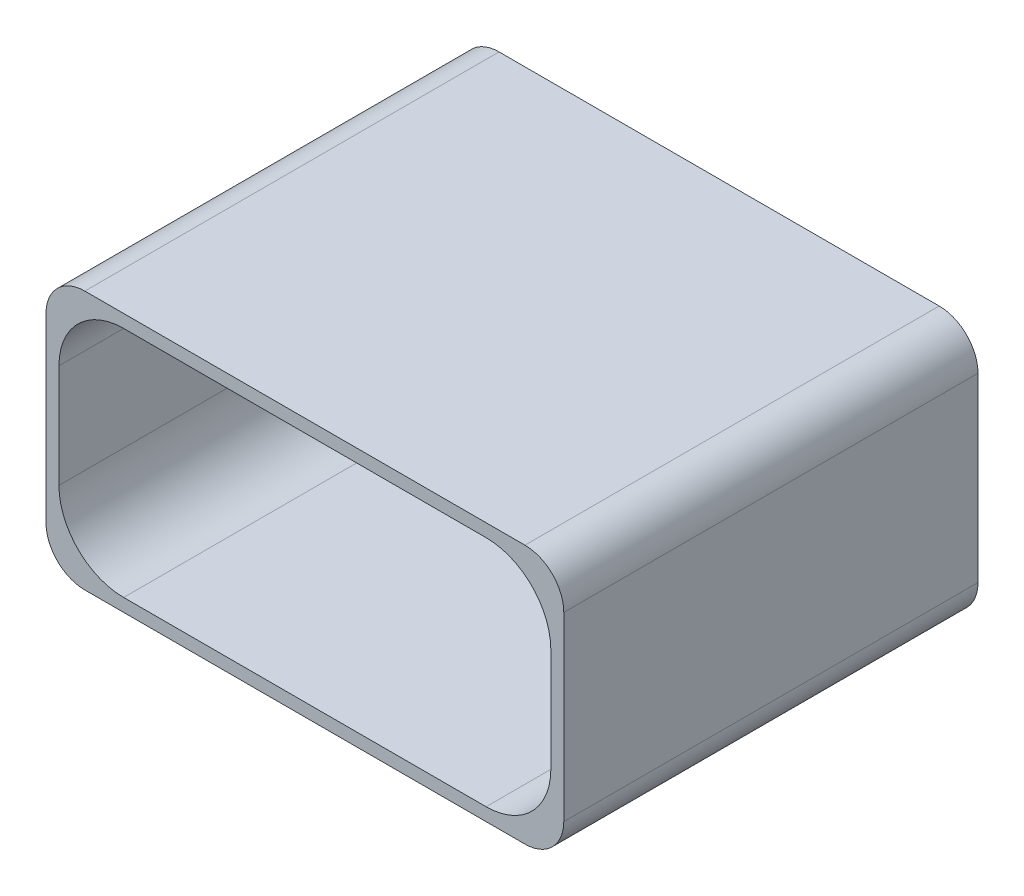
ISO-10303-21;
HEADER;
FILE_DESCRIPTION(('STEP AP214'),'2;1');
FILE_NAME('part.step','',(''),(''),'','','');
FILE_SCHEMA(('AUTOMOTIVE_DESIGN { 1 0 10303 214 1 1 1 1 }'));
ENDSEC;
DATA;
#1=APPLICATION_CONTEXT('core data for automotive mechanical design processes');
#2=APPLICATION_PROTOCOL_DEFINITION('international standard','automotive_design',2000,#1);
#3=PRODUCT_CONTEXT('',#1,'mechanical');
#4=PRODUCT('Part','Part','',(#3));
#5=PRODUCT_RELATED_PRODUCT_CATEGORY('part','',(#4));
#6=PRODUCT_DEFINITION_FORMATION('','',#4);
#7=PRODUCT_DEFINITION_CONTEXT('part definition',#1,'design');
#8=PRODUCT_DEFINITION('design','',#6,#7);
#9=PRODUCT_DEFINITION_SHAPE('','',#8);
#10=(LENGTH_UNIT() NAMED_UNIT(*) SI_UNIT(.MILLI.,.METRE.));
#11=(NAMED_UNIT(*) PLANE_ANGLE_UNIT() SI_UNIT($,.RADIAN.));
#12=(NAMED_UNIT(*) SI_UNIT($,.STERADIAN.) SOLID_ANGLE_UNIT());
#13=UNCERTAINTY_MEASURE_WITH_UNIT(LENGTH_MEASURE(1.E-05),#10,'distance_accuracy_value','');
#14=(GEOMETRIC_REPRESENTATION_CONTEXT(3) GLOBAL_UNCERTAINTY_ASSIGNED_CONTEXT((#13)) GLOBAL_UNIT_ASSIGNED_CONTEXT((#10,
#11,#12)) REPRESENTATION_CONTEXT('',''));
#15=CARTESIAN_POINT('',(0.,0.,0.));
#16=DIRECTION('',(0.,0.,1.));
#17=DIRECTION('',(1.,0.,0.));
#18=AXIS2_PLACEMENT_3D('',#15,#16,#17);
#19=CARTESIAN_POINT('',(0.,0.,10.));
#20=DIRECTION('',(0.,0.,1.));
#21=DIRECTION('',(1.,0.,0.));
#22=AXIS2_PLACEMENT_3D('',#19,#20,#21);
#23=PLANE('',#22);
#24=DIRECTION('',(-1.,0.,0.));
#25=VECTOR('',#24,1.);
#26=CARTESIAN_POINT('',(0.,39.5,10.));
#27=LINE('',#26,#25);
#28=CARTESIAN_POINT('',(144.,39.5,10.));
#29=VERTEX_POINT('',#28);
#30=CARTESIAN_POINT('',(134.,39.5,10.));
#31=VERTEX_POINT('',#30);
#32=EDGE_CURVE('E314',#29,#31,#27,.T.);
#33=ORIENTED_EDGE('',*,*,#32,.T.);
#34=DIRECTION('',(0.,-1.,0.));
#35=VECTOR('',#34,1.);
#36=CARTESIAN_POINT('',(134.,0.,10.));
#37=LINE('',#36,#35);
#38=CARTESIAN_POINT('',(134.,49.5,10.));
#39=VERTEX_POINT('',#38);
#40=EDGE_CURVE('E332',#39,#31,#37,.T.);
#41=ORIENTED_EDGE('',*,*,#40,.F.);
#42=DIRECTION('',(-1.,0.,0.));
#43=VECTOR('',#42,1.);
#44=CARTESIAN_POINT('',(0.,49.5,10.));
#45=LINE('',#44,#43);
#46=CARTESIAN_POINT('',(135.,49.5,10.));
#47=VERTEX_POINT('',#46);
#48=EDGE_CURVE('E380',#47,#39,#45,.T.);
#49=ORIENTED_EDGE('',*,*,#48,.F.);
#50=DIRECTION('',(0.,1.,0.));
#51=VECTOR('',#50,1.);
#52=CARTESIAN_POINT('',(135.,0.,10.));
#53=LINE('',#52,#51);
#54=CARTESIAN_POINT('',(135.,50.5,10.));
#55=VERTEX_POINT('',#54);
#56=EDGE_CURVE('E376',#47,#55,#53,.T.);
#57=ORIENTED_EDGE('',*,*,#56,.T.);
#58=DIRECTION('',(-1.,0.,0.));
#59=VECTOR('',#58,1.);
#60=CARTESIAN_POINT('',(0.,50.5,10.));
#61=LINE('',#60,#59);
#62=CARTESIAN_POINT('',(134.,50.5,10.));
#63=VERTEX_POINT('',#62);
#64=EDGE_CURVE('E372',#55,#63,#61,.T.);
#65=ORIENTED_EDGE('',*,*,#64,.T.);
#66=DIRECTION('',(0.,1.,0.));
#67=VECTOR('',#66,1.);
#68=CARTESIAN_POINT('',(134.,0.,10.));
#69=LINE('',#68,#67);
#70=CARTESIAN_POINT('',(134.,60.5,10.));
#71=VERTEX_POINT('',#70);
#72=EDGE_CURVE('E368',#63,#71,#69,.T.);
#73=ORIENTED_EDGE('',*,*,#72,.T.);
#74=DIRECTION('',(1.,0.,0.));
#75=VECTOR('',#74,1.);
#76=CARTESIAN_POINT('',(0.,60.5,10.));
#77=LINE('',#76,#75);
#78=CARTESIAN_POINT('',(144.,60.5,10.));
#79=VERTEX_POINT('',#78);
#80=EDGE_CURVE('E364',#71,#79,#77,.T.);
#81=ORIENTED_EDGE('',*,*,#80,.T.);
#82=DIRECTION('',(0.,-1.,0.));
#83=VECTOR('',#82,1.);
#84=CARTESIAN_POINT('',(144.,0.,10.));
#85=LINE('',#84,#83);
#86=EDGE_CURVE('E361',#79,#29,#85,.T.);
#87=ORIENTED_EDGE('',*,*,#86,.T.);
#88=EDGE_LOOP('',(#33,#41,#49,#57,#65,#73,#81,#87));
#89=FACE_BOUND('',#88,.T.);
#90=CARTESIAN_POINT('',(170.,70.,10.));
#91=DIRECTION('',(0.,0.,1.));
#92=DIRECTION('',(1.,0.,0.));
#93=AXIS2_PLACEMENT_3D('',#90,#91,#92);
#94=CIRCLE('',#93,25.);
#95=CARTESIAN_POINT('',(170.,95.,10.));
#96=VERTEX_POINT('',#95);
#97=CARTESIAN_POINT('',(195.,69.9999999999998,10.));
#98=VERTEX_POINT('',#97);
#99=EDGE_CURVE('E491',#96,#98,#94,.F.);
#100=ORIENTED_EDGE('',*,*,#99,.F.);
#101=DIRECTION('',(1.,0.,0.));
#102=VECTOR('',#101,1.);
#103=CARTESIAN_POINT('',(0.,95.,10.));
#104=LINE('',#103,#102);
#105=CARTESIAN_POINT('',(30.0000000000001,95.,10.));
#106=VERTEX_POINT('',#105);
#107=EDGE_CURVE('E485',#106,#96,#104,.T.);
#108=ORIENTED_EDGE('',*,*,#107,.F.);
#109=CARTESIAN_POINT('',(30.,70.,10.));
#110=DIRECTION('',(0.,0.,1.));
#111=DIRECTION('',(1.,0.,0.));
#112=AXIS2_PLACEMENT_3D('',#109,#110,#111);
#113=CIRCLE('',#112,25.);
#114=CARTESIAN_POINT('',(5.,69.9999999999999,10.));
#115=VERTEX_POINT('',#114);
#116=EDGE_CURVE('E522',#106,#115,#113,.T.);
#117=ORIENTED_EDGE('',*,*,#116,.T.);
#118=DIRECTION('',(0.,1.,0.));
#119=VECTOR('',#118,1.);
#120=CARTESIAN_POINT('',(5.,0.,10.));
#121=LINE('',#120,#119);
#122=CARTESIAN_POINT('',(5.,30.0000000000002,10.));
#123=VERTEX_POINT('',#122);
#124=EDGE_CURVE('E526',#123,#115,#121,.T.);
#125=ORIENTED_EDGE('',*,*,#124,.F.);
#126=CARTESIAN_POINT('',(30.,30.,10.));
#127=DIRECTION('',(0.,0.,1.));
#128=DIRECTION('',(1.,0.,0.));
#129=AXIS2_PLACEMENT_3D('',#126,#127,#128);
#130=CIRCLE('',#129,25.);
#131=CARTESIAN_POINT('',(30.0000000000001,4.99999999999998,10.));
#132=VERTEX_POINT('',#131);
#133=EDGE_CURVE('E530',#132,#123,#130,.F.);
#134=ORIENTED_EDGE('',*,*,#133,.F.);
#135=DIRECTION('',(-1.,0.,0.));
#136=VECTOR('',#135,1.);
#137=CARTESIAN_POINT('',(0.,4.99999999999998,10.));
#138=LINE('',#137,#136);
#139=CARTESIAN_POINT('',(170.,4.99999999999999,10.));
#140=VERTEX_POINT('',#139);
#141=EDGE_CURVE('E534',#140,#132,#138,.T.);
#142=ORIENTED_EDGE('',*,*,#141,.F.);
#143=CARTESIAN_POINT('',(170.,30.,10.));
#144=DIRECTION('',(0.,0.,1.));
#145=DIRECTION('',(1.,0.,0.));
#146=AXIS2_PLACEMENT_3D('',#143,#144,#145);
#147=CIRCLE('',#146,25.);
#148=CARTESIAN_POINT('',(195.,30.0000000000001,10.));
#149=VERTEX_POINT('',#148);
#150=EDGE_CURVE('E538',#149,#140,#147,.F.);
#151=ORIENTED_EDGE('',*,*,#150,.F.);
#152=DIRECTION('',(0.,-1.,0.));
#153=VECTOR('',#152,1.);
#154=CARTESIAN_POINT('',(195.,0.,10.));
#155=LINE('',#154,#153);
#156=EDGE_CURVE('E542',#98,#149,#155,.T.);
#157=ORIENTED_EDGE('',*,*,#156,.F.);
#158=EDGE_LOOP('',(#100,#108,#117,#125,#134,#142,#151,#157));
#159=FACE_BOUND('',#158,.T.);
#160=DIRECTION('',(0.,-1.,0.));
#161=VECTOR('',#160,1.);
#162=CARTESIAN_POINT('',(56.,0.,10.));
#163=LINE('',#162,#161);
#164=CARTESIAN_POINT('',(56.,60.5,10.));
#165=VERTEX_POINT('',#164);
#166=CARTESIAN_POINT('',(56.,39.5,10.));
#167=VERTEX_POINT('',#166);
#168=EDGE_CURVE('E437',#165,#167,#163,.T.);
#169=ORIENTED_EDGE('',*,*,#168,.F.);
#170=DIRECTION('',(-1.,0.,0.));
#171=VECTOR('',#170,1.);
#172=CARTESIAN_POINT('',(0.,60.5,10.));
#173=LINE('',#172,#171);
#174=CARTESIAN_POINT('',(66.,60.5,10.));
#175=VERTEX_POINT('',#174);
#176=EDGE_CURVE('E320',#175,#165,#173,.T.);
#177=ORIENTED_EDGE('',*,*,#176,.F.);
#178=DIRECTION('',(0.,1.,0.));
#179=VECTOR('',#178,1.);
#180=CARTESIAN_POINT('',(66.,0.,10.));
#181=LINE('',#180,#179);
#182=CARTESIAN_POINT('',(66.,50.5,10.));
#183=VERTEX_POINT('',#182);
#184=EDGE_CURVE('E408',#183,#175,#181,.T.);
#185=ORIENTED_EDGE('',*,*,#184,.F.);
#186=DIRECTION('',(1.,0.,0.));
#187=VECTOR('',#186,1.);
#188=CARTESIAN_POINT('',(-7.00828284294617E-13,50.4999999999991,10.));
#189=LINE('',#188,#187);
#190=CARTESIAN_POINT('',(65.,50.5,10.));
#191=VERTEX_POINT('',#190);
#192=EDGE_CURVE('E457',#191,#183,#189,.T.);
#193=ORIENTED_EDGE('',*,*,#192,.F.);
#194=DIRECTION('',(0.,-1.,0.));
#195=VECTOR('',#194,1.);
#196=CARTESIAN_POINT('',(65.,0.,10.));
#197=LINE('',#196,#195);
#198=CARTESIAN_POINT('',(65.,49.5,10.));
#199=VERTEX_POINT('',#198);
#200=EDGE_CURVE('E453',#191,#199,#197,.T.);
#201=ORIENTED_EDGE('',*,*,#200,.T.);
#202=DIRECTION('',(1.,0.,0.));
#203=VECTOR('',#202,1.);
#204=CARTESIAN_POINT('',(0.,49.5,10.));
#205=LINE('',#204,#203);
#206=CARTESIAN_POINT('',(66.,49.5,10.));
#207=VERTEX_POINT('',#206);
#208=EDGE_CURVE('E449',#199,#207,#205,.T.);
#209=ORIENTED_EDGE('',*,*,#208,.T.);
#210=DIRECTION('',(0.,-1.,0.));
#211=VECTOR('',#210,1.);
#212=CARTESIAN_POINT('',(66.,0.,10.));
#213=LINE('',#212,#211);
#214=CARTESIAN_POINT('',(66.,39.5,10.));
#215=VERTEX_POINT('',#214);
#216=EDGE_CURVE('E445',#207,#215,#213,.T.);
#217=ORIENTED_EDGE('',*,*,#216,.T.);
#218=DIRECTION('',(-1.,0.,0.));
#219=VECTOR('',#218,1.);
#220=CARTESIAN_POINT('',(0.,39.5,10.));
#221=LINE('',#220,#219);
#222=EDGE_CURVE('E441',#215,#167,#221,.T.);
#223=ORIENTED_EDGE('',*,*,#222,.T.);
#224=EDGE_LOOP('',(#169,#177,#185,#193,#201,#209,#217,#223));
#225=FACE_BOUND('',#224,.T.);
#226=ADVANCED_FACE('F96',(#89,#159,#225),#23,.T.);
#227=CARTESIAN_POINT('',(0.,100.,10.));
#228=DIRECTION('',(1.,0.,0.));
#229=DIRECTION('',(0.,0.,-1.));
#230=AXIS2_PLACEMENT_3D('',#227,#228,#229);
#231=PLANE('',#230);
#232=DIRECTION('',(0.,0.,1.));
#233=VECTOR('',#232,1.);
#234=CARTESIAN_POINT('',(0.,15.0000000000001,0.));
#235=LINE('',#234,#233);
#236=CARTESIAN_POINT('',(0.,15.,0.));
#237=VERTEX_POINT('',#236);
#238=CARTESIAN_POINT('',(0.,15.,160.));
#239=VERTEX_POINT('',#238);
#240=EDGE_CURVE('E622',#237,#239,#235,.T.);
#241=ORIENTED_EDGE('',*,*,#240,.T.);
#242=DIRECTION('',(0.,1.,0.));
#243=VECTOR('',#242,1.);
#244=CARTESIAN_POINT('',(0.,15.0000000000001,160.));
#245=LINE('',#244,#243);
#246=CARTESIAN_POINT('',(0.,84.9999999999999,160.));
#247=VERTEX_POINT('',#246);
#248=EDGE_CURVE('E580',#239,#247,#245,.T.);
#249=ORIENTED_EDGE('',*,*,#248,.T.);
#250=DIRECTION('',(0.,0.,1.));
#251=VECTOR('',#250,1.);
#252=CARTESIAN_POINT('',(0.,84.9999999999999,0.));
#253=LINE('',#252,#251);
#254=CARTESIAN_POINT('',(0.,84.9999999999999,0.));
#255=VERTEX_POINT('',#254);
#256=EDGE_CURVE('E638',#255,#247,#253,.T.);
#257=ORIENTED_EDGE('',*,*,#256,.F.);
#258=DIRECTION('',(0.,-1.,0.));
#259=VECTOR('',#258,1.);
#260=CARTESIAN_POINT('',(0.,100.,0.));
#261=LINE('',#260,#259);
#262=EDGE_CURVE('E641',#255,#237,#261,.T.);
#263=ORIENTED_EDGE('',*,*,#262,.T.);
#264=EDGE_LOOP('',(#241,#249,#257,#263));
#265=FACE_BOUND('',#264,.T.);
#266=ADVANCED_FACE('F98',(#265),#231,.F.);
#267=CARTESIAN_POINT('',(0.,0.,10.));
#268=DIRECTION('',(0.,1.,0.));
#269=DIRECTION('',(0.,0.,1.));
#270=AXIS2_PLACEMENT_3D('',#267,#268,#269);
#271=PLANE('',#270);
#272=DIRECTION('',(0.,0.,1.));
#273=VECTOR('',#272,1.);
#274=CARTESIAN_POINT('',(185.,0.,0.));
#275=LINE('',#274,#273);
#276=CARTESIAN_POINT('',(185.,0.,0.));
#277=VERTEX_POINT('',#276);
#278=CARTESIAN_POINT('',(185.,0.,160.));
#279=VERTEX_POINT('',#278);
#280=EDGE_CURVE('E610',#277,#279,#275,.T.);
#281=ORIENTED_EDGE('',*,*,#280,.T.);
#282=DIRECTION('',(-1.,0.,0.));
#283=VECTOR('',#282,1.);
#284=CARTESIAN_POINT('',(185.,0.,160.));
#285=LINE('',#284,#283);
#286=CARTESIAN_POINT('',(15.0000000000001,0.,160.));
#287=VERTEX_POINT('',#286);
#288=EDGE_CURVE('E588',#279,#287,#285,.T.);
#289=ORIENTED_EDGE('',*,*,#288,.T.);
#290=DIRECTION('',(0.,0.,1.));
#291=VECTOR('',#290,1.);
#292=CARTESIAN_POINT('',(15.0000000000001,0.,0.));
#293=LINE('',#292,#291);
#294=CARTESIAN_POINT('',(15.0000000000001,0.,0.));
#295=VERTEX_POINT('',#294);
#296=EDGE_CURVE('E630',#295,#287,#293,.T.);
#297=ORIENTED_EDGE('',*,*,#296,.F.);
#298=DIRECTION('',(1.,0.,0.));
#299=VECTOR('',#298,1.);
#300=CARTESIAN_POINT('',(0.,0.,0.));
#301=LINE('',#300,#299);
#302=EDGE_CURVE('E647',#295,#277,#301,.T.);
#303=ORIENTED_EDGE('',*,*,#302,.T.);
#304=EDGE_LOOP('',(#281,#289,#297,#303));
#305=FACE_BOUND('',#304,.T.);
#306=ADVANCED_FACE('F678',(#305),#271,.F.);
#307=CARTESIAN_POINT('',(200.,0.,10.));
#308=DIRECTION('',(-1.,0.,0.));
#309=DIRECTION('',(0.,0.,1.));
#310=AXIS2_PLACEMENT_3D('',#307,#308,#309);
#311=PLANE('',#310);
#312=DIRECTION('',(0.,0.,1.));
#313=VECTOR('',#312,1.);
#314=CARTESIAN_POINT('',(200.,84.9999999999999,0.));
#315=LINE('',#314,#313);
#316=CARTESIAN_POINT('',(200.,85.,0.));
#317=VERTEX_POINT('',#316);
#318=CARTESIAN_POINT('',(200.,84.9999999999999,160.));
#319=VERTEX_POINT('',#318);
#320=EDGE_CURVE('E611',#317,#319,#315,.T.);
#321=ORIENTED_EDGE('',*,*,#320,.T.);
#322=DIRECTION('',(0.,-1.,0.));
#323=VECTOR('',#322,1.);
#324=CARTESIAN_POINT('',(200.,84.9999999999999,160.));
#325=LINE('',#324,#323);
#326=CARTESIAN_POINT('',(200.,15.0000000000001,160.));
#327=VERTEX_POINT('',#326);
#328=EDGE_CURVE('E596',#319,#327,#325,.T.);
#329=ORIENTED_EDGE('',*,*,#328,.T.);
#330=DIRECTION('',(0.,0.,1.));
#331=VECTOR('',#330,1.);
#332=CARTESIAN_POINT('',(200.,15.0000000000001,0.));
#333=LINE('',#332,#331);
#334=CARTESIAN_POINT('',(200.,15.0000000000001,0.));
#335=VERTEX_POINT('',#334);
#336=EDGE_CURVE('E621',#335,#327,#333,.T.);
#337=ORIENTED_EDGE('',*,*,#336,.F.);
#338=DIRECTION('',(0.,1.,0.));
#339=VECTOR('',#338,1.);
#340=CARTESIAN_POINT('',(200.,0.,0.));
#341=LINE('',#340,#339);
#342=EDGE_CURVE('E105',#335,#317,#341,.T.);
#343=ORIENTED_EDGE('',*,*,#342,.T.);
#344=EDGE_LOOP('',(#321,#329,#337,#343));
#345=FACE_BOUND('',#344,.T.);
#346=ADVANCED_FACE('F655',(#345),#311,.F.);
#347=CARTESIAN_POINT('',(0.,0.,0.));
#348=DIRECTION('',(0.,0.,1.));
#349=DIRECTION('',(1.,0.,0.));
#350=AXIS2_PLACEMENT_3D('',#347,#348,#349);
#351=PLANE('',#350);
#352=ORIENTED_EDGE('',*,*,#302,.F.);
#353=CARTESIAN_POINT('',(15.,15.,0.));
#354=DIRECTION('',(0.,0.,1.));
#355=DIRECTION('',(1.,0.,0.));
#356=AXIS2_PLACEMENT_3D('',#353,#354,#355);
#357=CIRCLE('',#356,15.);
#358=EDGE_CURVE('E604',#295,#237,#357,.F.);
#359=ORIENTED_EDGE('',*,*,#358,.T.);
#360=ORIENTED_EDGE('',*,*,#262,.F.);
#361=CARTESIAN_POINT('',(15.,85.,0.));
#362=DIRECTION('',(0.,0.,1.));
#363=DIRECTION('',(1.,0.,0.));
#364=AXIS2_PLACEMENT_3D('',#361,#362,#363);
#365=CIRCLE('',#364,15.);
#366=CARTESIAN_POINT('',(15.0000000000001,100.,0.));
#367=VERTEX_POINT('',#366);
#368=EDGE_CURVE('E614',#367,#255,#365,.T.);
#369=ORIENTED_EDGE('',*,*,#368,.F.);
#370=DIRECTION('',(-1.,0.,0.));
#371=VECTOR('',#370,1.);
#372=CARTESIAN_POINT('',(200.,100.,0.));
#373=LINE('',#372,#371);
#374=CARTESIAN_POINT('',(185.,100.,0.));
#375=VERTEX_POINT('',#374);
#376=EDGE_CURVE('E12',#375,#367,#373,.T.);
#377=ORIENTED_EDGE('',*,*,#376,.F.);
#378=CARTESIAN_POINT('',(185.,85.,0.));
#379=DIRECTION('',(0.,0.,1.));
#380=DIRECTION('',(1.,0.,0.));
#381=AXIS2_PLACEMENT_3D('',#378,#379,#380);
#382=CIRCLE('',#381,15.);
#383=EDGE_CURVE('E605',#375,#317,#382,.F.);
#384=ORIENTED_EDGE('',*,*,#383,.T.);
#385=ORIENTED_EDGE('',*,*,#342,.F.);
#386=CARTESIAN_POINT('',(185.,15.,0.));
#387=DIRECTION('',(0.,0.,1.));
#388=DIRECTION('',(1.,0.,0.));
#389=AXIS2_PLACEMENT_3D('',#386,#387,#388);
#390=CIRCLE('',#389,15.);
#391=EDGE_CURVE('E617',#335,#277,#390,.F.);
#392=ORIENTED_EDGE('',*,*,#391,.T.);
#393=EDGE_LOOP('',(#352,#359,#360,#369,#377,#384,#385,#392));
#394=FACE_BOUND('',#393,.T.);
#395=ADVANCED_FACE('F659',(#394),#351,.F.);
#396=CARTESIAN_POINT('',(200.,100.,10.));
#397=DIRECTION('',(0.,-1.,0.));
#398=DIRECTION('',(1.,0.,0.));
#399=AXIS2_PLACEMENT_3D('',#396,#397,#398);
#400=PLANE('',#399);
#401=DIRECTION('',(0.,0.,1.));
#402=VECTOR('',#401,1.);
#403=CARTESIAN_POINT('',(15.0000000000001,100.,0.));
#404=LINE('',#403,#402);
#405=CARTESIAN_POINT('',(15.0000000000001,100.,160.));
#406=VERTEX_POINT('',#405);
#407=EDGE_CURVE('E637',#367,#406,#404,.T.);
#408=ORIENTED_EDGE('',*,*,#407,.T.);
#409=DIRECTION('',(-1.,0.,0.));
#410=VECTOR('',#409,1.);
#411=CARTESIAN_POINT('',(100.,100.,160.));
#412=LINE('',#411,#410);
#413=CARTESIAN_POINT('',(185.,100.,160.));
#414=VERTEX_POINT('',#413);
#415=EDGE_CURVE('E572',#414,#406,#412,.T.);
#416=ORIENTED_EDGE('',*,*,#415,.F.);
#417=DIRECTION('',(0.,0.,1.));
#418=VECTOR('',#417,1.);
#419=CARTESIAN_POINT('',(185.,100.,0.));
#420=LINE('',#419,#418);
#421=EDGE_CURVE('E609',#375,#414,#420,.T.);
#422=ORIENTED_EDGE('',*,*,#421,.F.);
#423=ORIENTED_EDGE('',*,*,#376,.T.);
#424=EDGE_LOOP('',(#408,#416,#422,#423));
#425=FACE_BOUND('',#424,.T.);
#426=ADVANCED_FACE('F667',(#425),#400,.F.);
#427=CARTESIAN_POINT('',(15.,85.,0.));
#428=DIRECTION('',(0.,0.,1.));
#429=DIRECTION('',(1.,0.,0.));
#430=AXIS2_PLACEMENT_3D('',#427,#428,#429);
#431=CYLINDRICAL_SURFACE('',#430,15.);
#432=ORIENTED_EDGE('',*,*,#256,.T.);
#433=CARTESIAN_POINT('',(15.,85.,160.));
#434=DIRECTION('',(0.,0.,1.));
#435=DIRECTION('',(1.,0.,0.));
#436=AXIS2_PLACEMENT_3D('',#433,#434,#435);
#437=CIRCLE('',#436,15.);
#438=EDGE_CURVE('E576',#406,#247,#437,.T.);
#439=ORIENTED_EDGE('',*,*,#438,.F.);
#440=ORIENTED_EDGE('',*,*,#407,.F.);
#441=ORIENTED_EDGE('',*,*,#368,.T.);
#442=EDGE_LOOP('',(#432,#439,#440,#441));
#443=FACE_BOUND('',#442,.T.);
#444=ADVANCED_FACE('F686',(#443),#431,.T.);
#445=CARTESIAN_POINT('',(185.,85.,0.));
#446=DIRECTION('',(0.,0.,1.));
#447=DIRECTION('',(1.,0.,0.));
#448=AXIS2_PLACEMENT_3D('',#445,#446,#447);
#449=CYLINDRICAL_SURFACE('',#448,15.);
#450=ORIENTED_EDGE('',*,*,#421,.T.);
#451=CARTESIAN_POINT('',(185.,85.,160.));
#452=DIRECTION('',(0.,0.,-1.));
#453=DIRECTION('',(-1.,0.,0.));
#454=AXIS2_PLACEMENT_3D('',#451,#452,#453);
#455=CIRCLE('',#454,15.);
#456=EDGE_CURVE('E600',#414,#319,#455,.T.);
#457=ORIENTED_EDGE('',*,*,#456,.T.);
#458=ORIENTED_EDGE('',*,*,#320,.F.);
#459=ORIENTED_EDGE('',*,*,#383,.F.);
#460=EDGE_LOOP('',(#450,#457,#458,#459));
#461=FACE_BOUND('',#460,.T.);
#462=ADVANCED_FACE('F664',(#461),#449,.T.);
#463=CARTESIAN_POINT('',(185.,15.,0.));
#464=DIRECTION('',(0.,0.,1.));
#465=DIRECTION('',(1.,0.,0.));
#466=AXIS2_PLACEMENT_3D('',#463,#464,#465);
#467=CYLINDRICAL_SURFACE('',#466,15.);
#468=ORIENTED_EDGE('',*,*,#336,.T.);
#469=CARTESIAN_POINT('',(185.,15.,160.));
#470=DIRECTION('',(0.,0.,-1.));
#471=DIRECTION('',(-1.,0.,0.));
#472=AXIS2_PLACEMENT_3D('',#469,#470,#471);
#473=CIRCLE('',#472,15.);
#474=EDGE_CURVE('E592',#327,#279,#473,.T.);
#475=ORIENTED_EDGE('',*,*,#474,.T.);
#476=ORIENTED_EDGE('',*,*,#280,.F.);
#477=ORIENTED_EDGE('',*,*,#391,.F.);
#478=EDGE_LOOP('',(#468,#475,#476,#477));
#479=FACE_BOUND('',#478,.T.);
#480=ADVANCED_FACE('F676',(#479),#467,.T.);
#481=CARTESIAN_POINT('',(15.,15.,0.));
#482=DIRECTION('',(0.,0.,1.));
#483=DIRECTION('',(1.,0.,0.));
#484=AXIS2_PLACEMENT_3D('',#481,#482,#483);
#485=CYLINDRICAL_SURFACE('',#484,15.);
#486=ORIENTED_EDGE('',*,*,#296,.T.);
#487=CARTESIAN_POINT('',(15.,15.,160.));
#488=DIRECTION('',(0.,0.,-1.));
#489=DIRECTION('',(-1.,0.,0.));
#490=AXIS2_PLACEMENT_3D('',#487,#488,#489);
#491=CIRCLE('',#490,15.);
#492=EDGE_CURVE('E584',#287,#239,#491,.T.);
#493=ORIENTED_EDGE('',*,*,#492,.T.);
#494=ORIENTED_EDGE('',*,*,#240,.F.);
#495=ORIENTED_EDGE('',*,*,#358,.F.);
#496=EDGE_LOOP('',(#486,#493,#494,#495));
#497=FACE_BOUND('',#496,.T.);
#498=ADVANCED_FACE('F687',(#497),#485,.T.);
#499=CARTESIAN_POINT('',(15.,85.,160.));
#500=DIRECTION('',(0.,0.,1.));
#501=DIRECTION('',(1.,0.,0.));
#502=AXIS2_PLACEMENT_3D('',#499,#500,#501);
#503=PLANE('',#502);
#504=DIRECTION('',(1.,0.,0.));
#505=VECTOR('',#504,1.);
#506=CARTESIAN_POINT('',(0.,95.,160.));
#507=LINE('',#506,#505);
#508=CARTESIAN_POINT('',(30.0000000000001,95.,160.));
#509=VERTEX_POINT('',#508);
#510=CARTESIAN_POINT('',(170.,95.,160.));
#511=VERTEX_POINT('',#510);
#512=EDGE_CURVE('E486',#509,#511,#507,.T.);
#513=ORIENTED_EDGE('',*,*,#512,.T.);
#514=CARTESIAN_POINT('',(170.,70.,160.));
#515=DIRECTION('',(0.,0.,1.));
#516=DIRECTION('',(1.,0.,0.));
#517=AXIS2_PLACEMENT_3D('',#514,#515,#516);
#518=CIRCLE('',#517,25.);
#519=CARTESIAN_POINT('',(195.,70.,160.));
#520=VERTEX_POINT('',#519);
#521=EDGE_CURVE('E514',#511,#520,#518,.F.);
#522=ORIENTED_EDGE('',*,*,#521,.T.);
#523=DIRECTION('',(0.,-1.,0.));
#524=VECTOR('',#523,1.);
#525=CARTESIAN_POINT('',(195.,0.,160.));
#526=LINE('',#525,#524);
#527=CARTESIAN_POINT('',(195.,30.0000000000001,160.));
#528=VERTEX_POINT('',#527);
#529=EDGE_CURVE('E510',#520,#528,#526,.T.);
#530=ORIENTED_EDGE('',*,*,#529,.T.);
#531=CARTESIAN_POINT('',(170.,30.,160.));
#532=DIRECTION('',(0.,0.,1.));
#533=DIRECTION('',(1.,0.,0.));
#534=AXIS2_PLACEMENT_3D('',#531,#532,#533);
#535=CIRCLE('',#534,25.);
#536=CARTESIAN_POINT('',(170.,4.99999999999999,160.));
#537=VERTEX_POINT('',#536);
#538=EDGE_CURVE('E506',#528,#537,#535,.F.);
#539=ORIENTED_EDGE('',*,*,#538,.T.);
#540=DIRECTION('',(-1.,0.,0.));
#541=VECTOR('',#540,1.);
#542=CARTESIAN_POINT('',(0.,4.99999999999998,160.));
#543=LINE('',#542,#541);
#544=CARTESIAN_POINT('',(30.0000000000001,4.99999999999998,160.));
#545=VERTEX_POINT('',#544);
#546=EDGE_CURVE('E502',#537,#545,#543,.T.);
#547=ORIENTED_EDGE('',*,*,#546,.T.);
#548=CARTESIAN_POINT('',(30.,30.,160.));
#549=DIRECTION('',(0.,0.,1.));
#550=DIRECTION('',(1.,0.,0.));
#551=AXIS2_PLACEMENT_3D('',#548,#549,#550);
#552=CIRCLE('',#551,25.);
#553=CARTESIAN_POINT('',(5.,30.0000000000002,160.));
#554=VERTEX_POINT('',#553);
#555=EDGE_CURVE('E498',#545,#554,#552,.F.);
#556=ORIENTED_EDGE('',*,*,#555,.T.);
#557=DIRECTION('',(0.,1.,0.));
#558=VECTOR('',#557,1.);
#559=CARTESIAN_POINT('',(5.,0.,160.));
#560=LINE('',#559,#558);
#561=CARTESIAN_POINT('',(5.,69.9999999999999,160.));
#562=VERTEX_POINT('',#561);
#563=EDGE_CURVE('E494',#554,#562,#560,.T.);
#564=ORIENTED_EDGE('',*,*,#563,.T.);
#565=CARTESIAN_POINT('',(30.,70.,160.));
#566=DIRECTION('',(0.,0.,1.));
#567=DIRECTION('',(1.,0.,0.));
#568=AXIS2_PLACEMENT_3D('',#565,#566,#567);
#569=CIRCLE('',#568,25.);
#570=EDGE_CURVE('E490',#509,#562,#569,.T.);
#571=ORIENTED_EDGE('',*,*,#570,.F.);
#572=EDGE_LOOP('',(#513,#522,#530,#539,#547,#556,#564,#571));
#573=FACE_BOUND('',#572,.T.);
#574=ORIENTED_EDGE('',*,*,#415,.T.);
#575=ORIENTED_EDGE('',*,*,#438,.T.);
#576=ORIENTED_EDGE('',*,*,#248,.F.);
#577=ORIENTED_EDGE('',*,*,#492,.F.);
#578=ORIENTED_EDGE('',*,*,#288,.F.);
#579=ORIENTED_EDGE('',*,*,#474,.F.);
#580=ORIENTED_EDGE('',*,*,#328,.F.);
#581=ORIENTED_EDGE('',*,*,#456,.F.);
#582=EDGE_LOOP('',(#574,#575,#576,#577,#578,#579,#580,#581));
#583=FACE_BOUND('',#582,.T.);
#584=ADVANCED_FACE('F671',(#573,#583),#503,.T.);
#585=CARTESIAN_POINT('',(0.,95.,160.));
#586=DIRECTION('',(0.,1.,0.));
#587=DIRECTION('',(0.,0.,1.));
#588=AXIS2_PLACEMENT_3D('',#585,#586,#587);
#589=PLANE('',#588);
#590=ORIENTED_EDGE('',*,*,#107,.T.);
#591=DIRECTION('',(0.,0.,-1.));
#592=VECTOR('',#591,1.);
#593=CARTESIAN_POINT('',(170.,95.,160.));
#594=LINE('',#593,#592);
#595=EDGE_CURVE('E518',#511,#96,#594,.T.);
#596=ORIENTED_EDGE('',*,*,#595,.F.);
#597=ORIENTED_EDGE('',*,*,#512,.F.);
#598=DIRECTION('',(0.,0.,-1.));
#599=VECTOR('',#598,1.);
#600=CARTESIAN_POINT('',(30.0000000000001,95.,160.));
#601=LINE('',#600,#599);
#602=EDGE_CURVE('E569',#509,#106,#601,.T.);
#603=ORIENTED_EDGE('',*,*,#602,.T.);
#604=EDGE_LOOP('',(#590,#596,#597,#603));
#605=FACE_BOUND('',#604,.T.);
#606=ADVANCED_FACE('F694',(#605),#589,.F.);
#607=CARTESIAN_POINT('',(30.,70.,160.));
#608=DIRECTION('',(0.,0.,-1.));
#609=DIRECTION('',(-1.,0.,0.));
#610=AXIS2_PLACEMENT_3D('',#607,#608,#609);
#611=CYLINDRICAL_SURFACE('',#610,25.);
#612=ORIENTED_EDGE('',*,*,#116,.F.);
#613=ORIENTED_EDGE('',*,*,#602,.F.);
#614=ORIENTED_EDGE('',*,*,#570,.T.);
#615=DIRECTION('',(0.,0.,-1.));
#616=VECTOR('',#615,1.);
#617=CARTESIAN_POINT('',(5.,69.9999999999999,160.));
#618=LINE('',#617,#616);
#619=EDGE_CURVE('E566',#562,#115,#618,.T.);
#620=ORIENTED_EDGE('',*,*,#619,.T.);
#621=EDGE_LOOP('',(#612,#613,#614,#620));
#622=FACE_BOUND('',#621,.T.);
#623=ADVANCED_FACE('F765',(#622),#611,.F.);
#624=CARTESIAN_POINT('',(5.,0.,160.));
#625=DIRECTION('',(-1.,0.,0.));
#626=DIRECTION('',(0.,0.,1.));
#627=AXIS2_PLACEMENT_3D('',#624,#625,#626);
#628=PLANE('',#627);
#629=ORIENTED_EDGE('',*,*,#124,.T.);
#630=ORIENTED_EDGE('',*,*,#619,.F.);
#631=ORIENTED_EDGE('',*,*,#563,.F.);
#632=DIRECTION('',(0.,0.,-1.));
#633=VECTOR('',#632,1.);
#634=CARTESIAN_POINT('',(5.,30.0000000000002,160.));
#635=LINE('',#634,#633);
#636=EDGE_CURVE('E563',#554,#123,#635,.T.);
#637=ORIENTED_EDGE('',*,*,#636,.T.);
#638=EDGE_LOOP('',(#629,#630,#631,#637));
#639=FACE_BOUND('',#638,.T.);
#640=ADVANCED_FACE('F775',(#639),#628,.F.);
#641=CARTESIAN_POINT('',(30.,30.,160.));
#642=DIRECTION('',(0.,0.,-1.));
#643=DIRECTION('',(-1.,0.,0.));
#644=AXIS2_PLACEMENT_3D('',#641,#642,#643);
#645=CYLINDRICAL_SURFACE('',#644,25.);
#646=ORIENTED_EDGE('',*,*,#133,.T.);
#647=ORIENTED_EDGE('',*,*,#636,.F.);
#648=ORIENTED_EDGE('',*,*,#555,.F.);
#649=DIRECTION('',(0.,0.,-1.));
#650=VECTOR('',#649,1.);
#651=CARTESIAN_POINT('',(30.0000000000001,4.99999999999998,160.));
#652=LINE('',#651,#650);
#653=EDGE_CURVE('E560',#545,#132,#652,.T.);
#654=ORIENTED_EDGE('',*,*,#653,.T.);
#655=EDGE_LOOP('',(#646,#647,#648,#654));
#656=FACE_BOUND('',#655,.T.);
#657=ADVANCED_FACE('F785',(#656),#645,.F.);
#658=CARTESIAN_POINT('',(0.,4.99999999999998,160.));
#659=DIRECTION('',(0.,-1.,0.));
#660=DIRECTION('',(1.,0.,0.));
#661=AXIS2_PLACEMENT_3D('',#658,#659,#660);
#662=PLANE('',#661);
#663=ORIENTED_EDGE('',*,*,#141,.T.);
#664=ORIENTED_EDGE('',*,*,#653,.F.);
#665=ORIENTED_EDGE('',*,*,#546,.F.);
#666=DIRECTION('',(0.,0.,-1.));
#667=VECTOR('',#666,1.);
#668=CARTESIAN_POINT('',(170.,4.99999999999999,160.));
#669=LINE('',#668,#667);
#670=EDGE_CURVE('E557',#537,#140,#669,.T.);
#671=ORIENTED_EDGE('',*,*,#670,.T.);
#672=EDGE_LOOP('',(#663,#664,#665,#671));
#673=FACE_BOUND('',#672,.T.);
#674=ADVANCED_FACE('F795',(#673),#662,.F.);
#675=CARTESIAN_POINT('',(170.,30.,160.));
#676=DIRECTION('',(0.,0.,-1.));
#677=DIRECTION('',(-1.,0.,0.));
#678=AXIS2_PLACEMENT_3D('',#675,#676,#677);
#679=CYLINDRICAL_SURFACE('',#678,25.);
#680=ORIENTED_EDGE('',*,*,#150,.T.);
#681=ORIENTED_EDGE('',*,*,#670,.F.);
#682=ORIENTED_EDGE('',*,*,#538,.F.);
#683=DIRECTION('',(0.,0.,-1.));
#684=VECTOR('',#683,1.);
#685=CARTESIAN_POINT('',(195.,30.0000000000001,160.));
#686=LINE('',#685,#684);
#687=EDGE_CURVE('E554',#528,#149,#686,.T.);
#688=ORIENTED_EDGE('',*,*,#687,.T.);
#689=EDGE_LOOP('',(#680,#681,#682,#688));
#690=FACE_BOUND('',#689,.T.);
#691=ADVANCED_FACE('F805',(#690),#679,.F.);
#692=CARTESIAN_POINT('',(195.,0.,160.));
#693=DIRECTION('',(1.,0.,0.));
#694=DIRECTION('',(0.,0.,-1.));
#695=AXIS2_PLACEMENT_3D('',#692,#693,#694);
#696=PLANE('',#695);
#697=ORIENTED_EDGE('',*,*,#156,.T.);
#698=ORIENTED_EDGE('',*,*,#687,.F.);
#699=ORIENTED_EDGE('',*,*,#529,.F.);
#700=DIRECTION('',(0.,0.,-1.));
#701=VECTOR('',#700,1.);
#702=CARTESIAN_POINT('',(195.,69.9999999999998,160.));
#703=LINE('',#702,#701);
#704=EDGE_CURVE('E551',#520,#98,#703,.T.);
#705=ORIENTED_EDGE('',*,*,#704,.T.);
#706=EDGE_LOOP('',(#697,#698,#699,#705));
#707=FACE_BOUND('',#706,.T.);
#708=ADVANCED_FACE('F815',(#707),#696,.F.);
#709=CARTESIAN_POINT('',(170.,70.,160.));
#710=DIRECTION('',(0.,0.,-1.));
#711=DIRECTION('',(-1.,0.,0.));
#712=AXIS2_PLACEMENT_3D('',#709,#710,#711);
#713=CYLINDRICAL_SURFACE('',#712,25.);
#714=ORIENTED_EDGE('',*,*,#99,.T.);
#715=ORIENTED_EDGE('',*,*,#704,.F.);
#716=ORIENTED_EDGE('',*,*,#521,.F.);
#717=ORIENTED_EDGE('',*,*,#595,.T.);
#718=EDGE_LOOP('',(#714,#715,#716,#717));
#719=FACE_BOUND('',#718,.T.);
#720=ADVANCED_FACE('F825',(#719),#713,.F.);
#721=CARTESIAN_POINT('',(0.,60.5,90.));
#722=DIRECTION('',(0.,-1.,0.));
#723=DIRECTION('',(0.,0.,-1.));
#724=AXIS2_PLACEMENT_3D('',#721,#722,#723);
#725=PLANE('',#724);
#726=ORIENTED_EDGE('',*,*,#176,.T.);
#727=DIRECTION('',(0.,0.,-1.));
#728=VECTOR('',#727,1.);
#729=CARTESIAN_POINT('',(56.,60.5,90.));
#730=LINE('',#729,#728);
#731=CARTESIAN_POINT('',(56.,60.5,90.));
#732=VERTEX_POINT('',#731);
#733=EDGE_CURVE('E482',#732,#165,#730,.T.);
#734=ORIENTED_EDGE('',*,*,#733,.F.);
#735=DIRECTION('',(-1.,0.,0.));
#736=VECTOR('',#735,1.);
#737=CARTESIAN_POINT('',(0.,60.5,90.));
#738=LINE('',#737,#736);
#739=CARTESIAN_POINT('',(66.,60.5,90.));
#740=VERTEX_POINT('',#739);
#741=EDGE_CURVE('E403',#740,#732,#738,.T.);
#742=ORIENTED_EDGE('',*,*,#741,.F.);
#743=DIRECTION('',(0.,0.,-1.));
#744=VECTOR('',#743,1.);
#745=CARTESIAN_POINT('',(66.,60.5,90.));
#746=LINE('',#745,#744);
#747=EDGE_CURVE('E433',#740,#175,#746,.T.);
#748=ORIENTED_EDGE('',*,*,#747,.T.);
#749=EDGE_LOOP('',(#726,#734,#742,#748));
#750=FACE_BOUND('',#749,.T.);
#751=ADVANCED_FACE('F834',(#750),#725,.F.);
#752=CARTESIAN_POINT('',(56.,0.,90.));
#753=DIRECTION('',(1.,0.,0.));
#754=DIRECTION('',(0.,0.,-1.));
#755=AXIS2_PLACEMENT_3D('',#752,#753,#754);
#756=PLANE('',#755);
#757=ORIENTED_EDGE('',*,*,#168,.T.);
#758=DIRECTION('',(0.,0.,-1.));
#759=VECTOR('',#758,1.);
#760=CARTESIAN_POINT('',(56.,39.5,90.));
#761=LINE('',#760,#759);
#762=CARTESIAN_POINT('',(56.,39.5,90.));
#763=VERTEX_POINT('',#762);
#764=EDGE_CURVE('E479',#763,#167,#761,.T.);
#765=ORIENTED_EDGE('',*,*,#764,.F.);
#766=DIRECTION('',(0.,-1.,0.));
#767=VECTOR('',#766,1.);
#768=CARTESIAN_POINT('',(56.,0.,90.));
#769=LINE('',#768,#767);
#770=EDGE_CURVE('E407',#732,#763,#769,.T.);
#771=ORIENTED_EDGE('',*,*,#770,.F.);
#772=ORIENTED_EDGE('',*,*,#733,.T.);
#773=EDGE_LOOP('',(#757,#765,#771,#772));
#774=FACE_BOUND('',#773,.T.);
#775=ADVANCED_FACE('F849',(#774),#756,.F.);
#776=CARTESIAN_POINT('',(0.,39.5,90.));
#777=DIRECTION('',(0.,-1.,0.));
#778=DIRECTION('',(1.,0.,0.));
#779=AXIS2_PLACEMENT_3D('',#776,#777,#778);
#780=PLANE('',#779);
#781=ORIENTED_EDGE('',*,*,#222,.F.);
#782=DIRECTION('',(0.,0.,-1.));
#783=VECTOR('',#782,1.);
#784=CARTESIAN_POINT('',(66.,39.5,90.));
#785=LINE('',#784,#783);
#786=CARTESIAN_POINT('',(66.,39.5,90.));
#787=VERTEX_POINT('',#786);
#788=EDGE_CURVE('E476',#787,#215,#785,.T.);
#789=ORIENTED_EDGE('',*,*,#788,.F.);
#790=DIRECTION('',(-1.,0.,0.));
#791=VECTOR('',#790,1.);
#792=CARTESIAN_POINT('',(0.,39.5,90.));
#793=LINE('',#792,#791);
#794=EDGE_CURVE('E411',#787,#763,#793,.T.);
#795=ORIENTED_EDGE('',*,*,#794,.T.);
#796=ORIENTED_EDGE('',*,*,#764,.T.);
#797=EDGE_LOOP('',(#781,#789,#795,#796));
#798=FACE_BOUND('',#797,.T.);
#799=ADVANCED_FACE('F859',(#798),#780,.T.);
#800=CARTESIAN_POINT('',(66.,0.,90.));
#801=DIRECTION('',(1.,0.,0.));
#802=DIRECTION('',(0.,0.,-1.));
#803=AXIS2_PLACEMENT_3D('',#800,#801,#802);
#804=PLANE('',#803);
#805=ORIENTED_EDGE('',*,*,#216,.F.);
#806=DIRECTION('',(0.,0.,-1.));
#807=VECTOR('',#806,1.);
#808=CARTESIAN_POINT('',(66.,49.5,90.));
#809=LINE('',#808,#807);
#810=CARTESIAN_POINT('',(66.,49.5,90.));
#811=VERTEX_POINT('',#810);
#812=EDGE_CURVE('E473',#811,#207,#809,.T.);
#813=ORIENTED_EDGE('',*,*,#812,.F.);
#814=DIRECTION('',(0.,-1.,0.));
#815=VECTOR('',#814,1.);
#816=CARTESIAN_POINT('',(66.,0.,90.));
#817=LINE('',#816,#815);
#818=EDGE_CURVE('E415',#811,#787,#817,.T.);
#819=ORIENTED_EDGE('',*,*,#818,.T.);
#820=ORIENTED_EDGE('',*,*,#788,.T.);
#821=EDGE_LOOP('',(#805,#813,#819,#820));
#822=FACE_BOUND('',#821,.T.);
#823=ADVANCED_FACE('F869',(#822),#804,.T.);
#824=CARTESIAN_POINT('',(0.,49.5,90.));
#825=DIRECTION('',(0.,1.,0.));
#826=DIRECTION('',(0.,0.,1.));
#827=AXIS2_PLACEMENT_3D('',#824,#825,#826);
#828=PLANE('',#827);
#829=ORIENTED_EDGE('',*,*,#208,.F.);
#830=DIRECTION('',(0.,0.,-1.));
#831=VECTOR('',#830,1.);
#832=CARTESIAN_POINT('',(65.,49.5,90.));
#833=LINE('',#832,#831);
#834=CARTESIAN_POINT('',(65.,49.5,90.));
#835=VERTEX_POINT('',#834);
#836=EDGE_CURVE('E470',#835,#199,#833,.T.);
#837=ORIENTED_EDGE('',*,*,#836,.F.);
#838=DIRECTION('',(1.,0.,0.));
#839=VECTOR('',#838,1.);
#840=CARTESIAN_POINT('',(0.,49.5,90.));
#841=LINE('',#840,#839);
#842=EDGE_CURVE('E419',#835,#811,#841,.T.);
#843=ORIENTED_EDGE('',*,*,#842,.T.);
#844=ORIENTED_EDGE('',*,*,#812,.T.);
#845=EDGE_LOOP('',(#829,#837,#843,#844));
#846=FACE_BOUND('',#845,.T.);
#847=ADVANCED_FACE('F879',(#846),#828,.T.);
#848=CARTESIAN_POINT('',(65.,0.,90.));
#849=DIRECTION('',(1.,0.,0.));
#850=DIRECTION('',(0.,0.,-1.));
#851=AXIS2_PLACEMENT_3D('',#848,#849,#850);
#852=PLANE('',#851);
#853=ORIENTED_EDGE('',*,*,#200,.F.);
#854=DIRECTION('',(0.,0.,-1.));
#855=VECTOR('',#854,1.);
#856=CARTESIAN_POINT('',(65.,50.5,90.));
#857=LINE('',#856,#855);
#858=CARTESIAN_POINT('',(65.,50.5,90.));
#859=VERTEX_POINT('',#858);
#860=EDGE_CURVE('E467',#859,#191,#857,.T.);
#861=ORIENTED_EDGE('',*,*,#860,.F.);
#862=DIRECTION('',(0.,-1.,0.));
#863=VECTOR('',#862,1.);
#864=CARTESIAN_POINT('',(65.,0.,90.));
#865=LINE('',#864,#863);
#866=EDGE_CURVE('E423',#859,#835,#865,.T.);
#867=ORIENTED_EDGE('',*,*,#866,.T.);
#868=ORIENTED_EDGE('',*,*,#836,.T.);
#869=EDGE_LOOP('',(#853,#861,#867,#868));
#870=FACE_BOUND('',#869,.T.);
#871=ADVANCED_FACE('F889',(#870),#852,.T.);
#872=CARTESIAN_POINT('',(-7.00828284294617E-13,50.4999999999991,90.));
#873=DIRECTION('',(0.,1.,0.));
#874=DIRECTION('',(-1.,0.,0.));
#875=AXIS2_PLACEMENT_3D('',#872,#873,#874);
#876=PLANE('',#875);
#877=ORIENTED_EDGE('',*,*,#192,.T.);
#878=DIRECTION('',(0.,0.,-1.));
#879=VECTOR('',#878,1.);
#880=CARTESIAN_POINT('',(66.,50.5,90.));
#881=LINE('',#880,#879);
#882=CARTESIAN_POINT('',(66.,50.5,90.));
#883=VERTEX_POINT('',#882);
#884=EDGE_CURVE('E120',#883,#183,#881,.T.);
#885=ORIENTED_EDGE('',*,*,#884,.F.);
#886=DIRECTION('',(1.,0.,0.));
#887=VECTOR('',#886,1.);
#888=CARTESIAN_POINT('',(-7.00828284294617E-13,50.4999999999991,90.));
#889=LINE('',#888,#887);
#890=EDGE_CURVE('E427',#859,#883,#889,.T.);
#891=ORIENTED_EDGE('',*,*,#890,.F.);
#892=ORIENTED_EDGE('',*,*,#860,.T.);
#893=EDGE_LOOP('',(#877,#885,#891,#892));
#894=FACE_BOUND('',#893,.T.);
#895=ADVANCED_FACE('F900',(#894),#876,.F.);
#896=CARTESIAN_POINT('',(66.,0.,90.));
#897=DIRECTION('',(-1.,0.,0.));
#898=DIRECTION('',(0.,0.,1.));
#899=AXIS2_PLACEMENT_3D('',#896,#897,#898);
#900=PLANE('',#899);
#901=ORIENTED_EDGE('',*,*,#184,.T.);
#902=ORIENTED_EDGE('',*,*,#747,.F.);
#903=DIRECTION('',(0.,1.,0.));
#904=VECTOR('',#903,1.);
#905=CARTESIAN_POINT('',(66.,0.,90.));
#906=LINE('',#905,#904);
#907=EDGE_CURVE('E430',#883,#740,#906,.T.);
#908=ORIENTED_EDGE('',*,*,#907,.F.);
#909=ORIENTED_EDGE('',*,*,#884,.T.);
#910=EDGE_LOOP('',(#901,#902,#908,#909));
#911=FACE_BOUND('',#910,.T.);
#912=ADVANCED_FACE('F910',(#911),#900,.F.);
#913=CARTESIAN_POINT('',(0.,0.,90.));
#914=DIRECTION('',(0.,0.,1.));
#915=DIRECTION('',(1.,0.,0.));
#916=AXIS2_PLACEMENT_3D('',#913,#914,#915);
#917=PLANE('',#916);
#918=ORIENTED_EDGE('',*,*,#741,.T.);
#919=ORIENTED_EDGE('',*,*,#770,.T.);
#920=ORIENTED_EDGE('',*,*,#794,.F.);
#921=ORIENTED_EDGE('',*,*,#818,.F.);
#922=ORIENTED_EDGE('',*,*,#842,.F.);
#923=ORIENTED_EDGE('',*,*,#866,.F.);
#924=ORIENTED_EDGE('',*,*,#890,.T.);
#925=ORIENTED_EDGE('',*,*,#907,.T.);
#926=EDGE_LOOP('',(#918,#919,#920,#921,#922,#923,#924,#925));
#927=FACE_BOUND('',#926,.T.);
#928=ADVANCED_FACE('F920',(#927),#917,.T.);
#929=CARTESIAN_POINT('',(0.,39.5,90.));
#930=DIRECTION('',(0.,-1.,0.));
#931=DIRECTION('',(0.,0.,-1.));
#932=AXIS2_PLACEMENT_3D('',#929,#930,#931);
#933=PLANE('',#932);
#934=ORIENTED_EDGE('',*,*,#32,.F.);
#935=DIRECTION('',(0.,0.,-1.));
#936=VECTOR('',#935,1.);
#937=CARTESIAN_POINT('',(144.,39.5,90.));
#938=LINE('',#937,#936);
#939=CARTESIAN_POINT('',(144.,39.5,90.));
#940=VERTEX_POINT('',#939);
#941=EDGE_CURVE('E309',#940,#29,#938,.T.);
#942=ORIENTED_EDGE('',*,*,#941,.F.);
#943=DIRECTION('',(-1.,0.,0.));
#944=VECTOR('',#943,1.);
#945=CARTESIAN_POINT('',(0.,39.5,90.));
#946=LINE('',#945,#944);
#947=CARTESIAN_POINT('',(134.,39.5,90.));
#948=VERTEX_POINT('',#947);
#949=EDGE_CURVE('E312',#940,#948,#946,.T.);
#950=ORIENTED_EDGE('',*,*,#949,.T.);
#951=DIRECTION('',(0.,0.,-1.));
#952=VECTOR('',#951,1.);
#953=CARTESIAN_POINT('',(134.,39.5,90.));
#954=LINE('',#953,#952);
#955=EDGE_CURVE('E358',#948,#31,#954,.T.);
#956=ORIENTED_EDGE('',*,*,#955,.T.);
#957=EDGE_LOOP('',(#934,#942,#950,#956));
#958=FACE_BOUND('',#957,.T.);
#959=ADVANCED_FACE('F311',(#958),#933,.T.);
#960=CARTESIAN_POINT('',(144.,0.,90.));
#961=DIRECTION('',(1.,0.,0.));
#962=DIRECTION('',(0.,0.,-1.));
#963=AXIS2_PLACEMENT_3D('',#960,#961,#962);
#964=PLANE('',#963);
#965=ORIENTED_EDGE('',*,*,#86,.F.);
#966=DIRECTION('',(0.,0.,-1.));
#967=VECTOR('',#966,1.);
#968=CARTESIAN_POINT('',(144.,60.5,90.));
#969=LINE('',#968,#967);
#970=CARTESIAN_POINT('',(144.,60.5,90.));
#971=VERTEX_POINT('',#970);
#972=EDGE_CURVE('E321',#971,#79,#969,.T.);
#973=ORIENTED_EDGE('',*,*,#972,.F.);
#974=DIRECTION('',(0.,-1.,0.));
#975=VECTOR('',#974,1.);
#976=CARTESIAN_POINT('',(144.,0.,90.));
#977=LINE('',#976,#975);
#978=EDGE_CURVE('E327',#971,#940,#977,.T.);
#979=ORIENTED_EDGE('',*,*,#978,.T.);
#980=ORIENTED_EDGE('',*,*,#941,.T.);
#981=EDGE_LOOP('',(#965,#973,#979,#980));
#982=FACE_BOUND('',#981,.T.);
#983=ADVANCED_FACE('F334',(#982),#964,.T.);
#984=CARTESIAN_POINT('',(0.,60.5,90.));
#985=DIRECTION('',(0.,1.,0.));
#986=DIRECTION('',(0.,0.,1.));
#987=AXIS2_PLACEMENT_3D('',#984,#985,#986);
#988=PLANE('',#987);
#989=ORIENTED_EDGE('',*,*,#80,.F.);
#990=DIRECTION('',(0.,0.,-1.));
#991=VECTOR('',#990,1.);
#992=CARTESIAN_POINT('',(134.,60.5,90.));
#993=LINE('',#992,#991);
#994=CARTESIAN_POINT('',(134.,60.5,90.));
#995=VERTEX_POINT('',#994);
#996=EDGE_CURVE('E398',#995,#71,#993,.T.);
#997=ORIENTED_EDGE('',*,*,#996,.F.);
#998=DIRECTION('',(1.,0.,0.));
#999=VECTOR('',#998,1.);
#1000=CARTESIAN_POINT('',(0.,60.5,90.));
#1001=LINE('',#1000,#999);
#1002=EDGE_CURVE('E336',#995,#971,#1001,.T.);
#1003=ORIENTED_EDGE('',*,*,#1002,.T.);
#1004=ORIENTED_EDGE('',*,*,#972,.T.);
#1005=EDGE_LOOP('',(#989,#997,#1003,#1004));
#1006=FACE_BOUND('',#1005,.T.);
#1007=ADVANCED_FACE('F946',(#1006),#988,.T.);
#1008=CARTESIAN_POINT('',(134.,0.,90.));
#1009=DIRECTION('',(-1.,0.,0.));
#1010=DIRECTION('',(0.,0.,1.));
#1011=AXIS2_PLACEMENT_3D('',#1008,#1009,#1010);
#1012=PLANE('',#1011);
#1013=ORIENTED_EDGE('',*,*,#72,.F.);
#1014=DIRECTION('',(0.,0.,-1.));
#1015=VECTOR('',#1014,1.);
#1016=CARTESIAN_POINT('',(134.,50.5,90.));
#1017=LINE('',#1016,#1015);
#1018=CARTESIAN_POINT('',(134.,50.5,90.));
#1019=VERTEX_POINT('',#1018);
#1020=EDGE_CURVE('E395',#1019,#63,#1017,.T.);
#1021=ORIENTED_EDGE('',*,*,#1020,.F.);
#1022=DIRECTION('',(0.,1.,0.));
#1023=VECTOR('',#1022,1.);
#1024=CARTESIAN_POINT('',(134.,0.,90.));
#1025=LINE('',#1024,#1023);
#1026=EDGE_CURVE('E339',#1019,#995,#1025,.T.);
#1027=ORIENTED_EDGE('',*,*,#1026,.T.);
#1028=ORIENTED_EDGE('',*,*,#996,.T.);
#1029=EDGE_LOOP('',(#1013,#1021,#1027,#1028));
#1030=FACE_BOUND('',#1029,.T.);
#1031=ADVANCED_FACE('F955',(#1030),#1012,.T.);
#1032=CARTESIAN_POINT('',(0.,50.5,90.));
#1033=DIRECTION('',(0.,-1.,0.));
#1034=DIRECTION('',(0.,0.,-1.));
#1035=AXIS2_PLACEMENT_3D('',#1032,#1033,#1034);
#1036=PLANE('',#1035);
#1037=ORIENTED_EDGE('',*,*,#64,.F.);
#1038=DIRECTION('',(0.,0.,-1.));
#1039=VECTOR('',#1038,1.);
#1040=CARTESIAN_POINT('',(135.,50.5,90.));
#1041=LINE('',#1040,#1039);
#1042=CARTESIAN_POINT('',(135.,50.5,90.));
#1043=VERTEX_POINT('',#1042);
#1044=EDGE_CURVE('E392',#1043,#55,#1041,.T.);
#1045=ORIENTED_EDGE('',*,*,#1044,.F.);
#1046=DIRECTION('',(-1.,0.,0.));
#1047=VECTOR('',#1046,1.);
#1048=CARTESIAN_POINT('',(0.,50.5,90.));
#1049=LINE('',#1048,#1047);
#1050=EDGE_CURVE('E345',#1043,#1019,#1049,.T.);
#1051=ORIENTED_EDGE('',*,*,#1050,.T.);
#1052=ORIENTED_EDGE('',*,*,#1020,.T.);
#1053=EDGE_LOOP('',(#1037,#1045,#1051,#1052));
#1054=FACE_BOUND('',#1053,.T.);
#1055=ADVANCED_FACE('F965',(#1054),#1036,.T.);
#1056=CARTESIAN_POINT('',(135.,0.,90.));
#1057=DIRECTION('',(-1.,0.,0.));
#1058=DIRECTION('',(0.,0.,1.));
#1059=AXIS2_PLACEMENT_3D('',#1056,#1057,#1058);
#1060=PLANE('',#1059);
#1061=ORIENTED_EDGE('',*,*,#56,.F.);
#1062=DIRECTION('',(0.,0.,-1.));
#1063=VECTOR('',#1062,1.);
#1064=CARTESIAN_POINT('',(135.,49.5,90.));
#1065=LINE('',#1064,#1063);
#1066=CARTESIAN_POINT('',(135.,49.5,90.));
#1067=VERTEX_POINT('',#1066);
#1068=EDGE_CURVE('E389',#1067,#47,#1065,.T.);
#1069=ORIENTED_EDGE('',*,*,#1068,.F.);
#1070=DIRECTION('',(0.,1.,0.));
#1071=VECTOR('',#1070,1.);
#1072=CARTESIAN_POINT('',(135.,0.,90.));
#1073=LINE('',#1072,#1071);
#1074=EDGE_CURVE('E349',#1067,#1043,#1073,.T.);
#1075=ORIENTED_EDGE('',*,*,#1074,.T.);
#1076=ORIENTED_EDGE('',*,*,#1044,.T.);
#1077=EDGE_LOOP('',(#1061,#1069,#1075,#1076));
#1078=FACE_BOUND('',#1077,.T.);
#1079=ADVANCED_FACE('F975',(#1078),#1060,.T.);
#1080=CARTESIAN_POINT('',(0.,49.5,90.));
#1081=DIRECTION('',(0.,-1.,0.));
#1082=DIRECTION('',(0.,0.,-1.));
#1083=AXIS2_PLACEMENT_3D('',#1080,#1081,#1082);
#1084=PLANE('',#1083);
#1085=ORIENTED_EDGE('',*,*,#48,.T.);
#1086=DIRECTION('',(0.,0.,-1.));
#1087=VECTOR('',#1086,1.);
#1088=CARTESIAN_POINT('',(134.,49.5,90.));
#1089=LINE('',#1088,#1087);
#1090=CARTESIAN_POINT('',(134.,49.5,90.));
#1091=VERTEX_POINT('',#1090);
#1092=EDGE_CURVE('E112',#1091,#39,#1089,.T.);
#1093=ORIENTED_EDGE('',*,*,#1092,.F.);
#1094=DIRECTION('',(-1.,0.,0.));
#1095=VECTOR('',#1094,1.);
#1096=CARTESIAN_POINT('',(0.,49.5,90.));
#1097=LINE('',#1096,#1095);
#1098=EDGE_CURVE('E353',#1067,#1091,#1097,.T.);
#1099=ORIENTED_EDGE('',*,*,#1098,.F.);
#1100=ORIENTED_EDGE('',*,*,#1068,.T.);
#1101=EDGE_LOOP('',(#1085,#1093,#1099,#1100));
#1102=FACE_BOUND('',#1101,.T.);
#1103=ADVANCED_FACE('F986',(#1102),#1084,.F.);
#1104=CARTESIAN_POINT('',(134.,0.,90.));
#1105=DIRECTION('',(1.,0.,0.));
#1106=DIRECTION('',(0.,0.,-1.));
#1107=AXIS2_PLACEMENT_3D('',#1104,#1105,#1106);
#1108=PLANE('',#1107);
#1109=ORIENTED_EDGE('',*,*,#40,.T.);
#1110=ORIENTED_EDGE('',*,*,#955,.F.);
#1111=DIRECTION('',(0.,-1.,0.));
#1112=VECTOR('',#1111,1.);
#1113=CARTESIAN_POINT('',(134.,0.,90.));
#1114=LINE('',#1113,#1112);
#1115=EDGE_CURVE('E329',#1091,#948,#1114,.T.);
#1116=ORIENTED_EDGE('',*,*,#1115,.F.);
#1117=ORIENTED_EDGE('',*,*,#1092,.T.);
#1118=EDGE_LOOP('',(#1109,#1110,#1116,#1117));
#1119=FACE_BOUND('',#1118,.T.);
#1120=ADVANCED_FACE('F996',(#1119),#1108,.F.);
#1121=CARTESIAN_POINT('',(0.,0.,90.));
#1122=DIRECTION('',(0.,0.,1.));
#1123=DIRECTION('',(1.,0.,0.));
#1124=AXIS2_PLACEMENT_3D('',#1121,#1122,#1123);
#1125=PLANE('',#1124);
#1126=ORIENTED_EDGE('',*,*,#949,.F.);
#1127=ORIENTED_EDGE('',*,*,#978,.F.);
#1128=ORIENTED_EDGE('',*,*,#1002,.F.);
#1129=ORIENTED_EDGE('',*,*,#1026,.F.);
#1130=ORIENTED_EDGE('',*,*,#1050,.F.);
#1131=ORIENTED_EDGE('',*,*,#1074,.F.);
#1132=ORIENTED_EDGE('',*,*,#1098,.T.);
#1133=ORIENTED_EDGE('',*,*,#1115,.T.);
#1134=EDGE_LOOP('',(#1126,#1127,#1128,#1129,#1130,#1131,#1132,#1133));
#1135=FACE_BOUND('',#1134,.T.);
#1136=ADVANCED_FACE('F325',(#1135),#1125,.T.);
#1137=CLOSED_SHELL('',(#226,#266,#306,#346,#395,#426,#444,#462,#480,#498,#584,#606,#623,#640,
#657,#674,#691,#708,#720,#751,#775,#799,#823,#847,#871,#895,#912,#928,#959,#983,#1007,#1031,
#1055,#1079,#1103,#1120,#1136));
#1138=MANIFOLD_SOLID_BREP('B2',#1137);
#1139=ADVANCED_BREP_SHAPE_REPRESENTATION('',(#18,#1138),#14);
#1140=SHAPE_DEFINITION_REPRESENTATION(#9,#1139);
ENDSEC;
END-ISO-10303-21;
